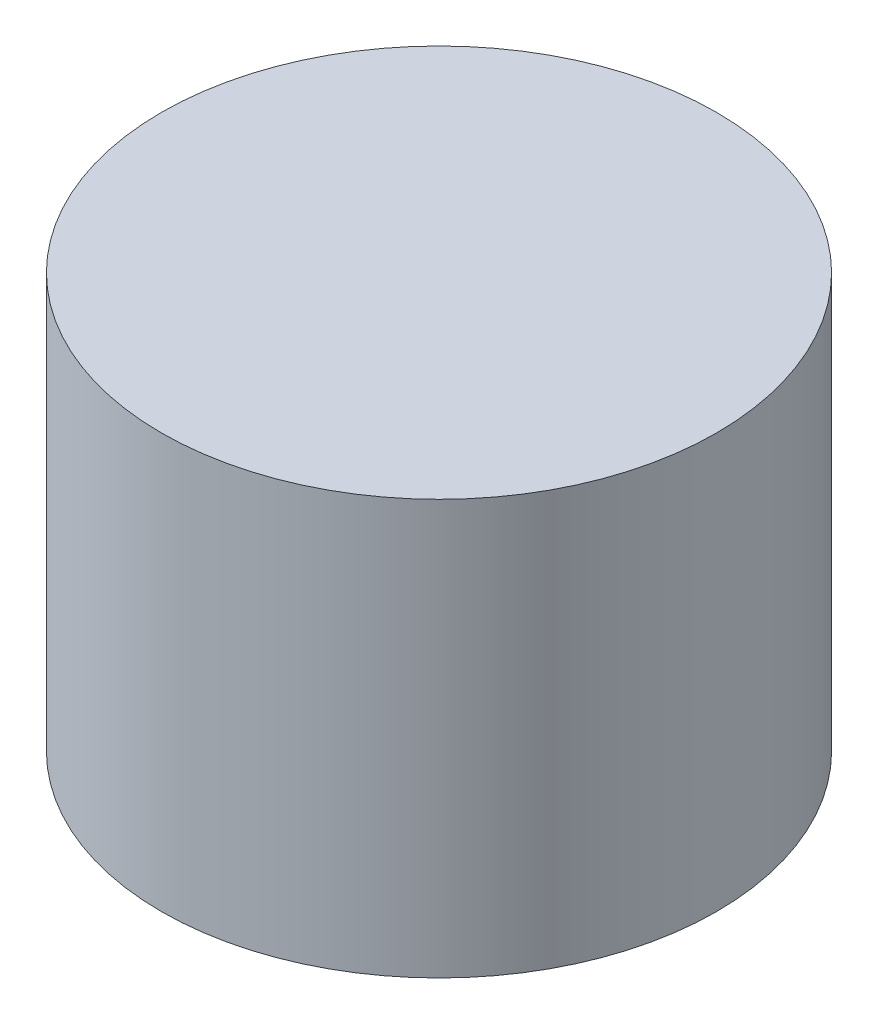
ISO-10303-21;
HEADER;
FILE_DESCRIPTION(('STEP AP214'),'2;1');
FILE_NAME('part.step','',(''),(''),'','','');
FILE_SCHEMA(('AUTOMOTIVE_DESIGN { 1 0 10303 214 1 1 1 1 }'));
ENDSEC;
DATA;
#1=APPLICATION_CONTEXT('core data for automotive mechanical design processes');
#2=APPLICATION_PROTOCOL_DEFINITION('international standard','automotive_design',2000,#1);
#3=PRODUCT_CONTEXT('',#1,'mechanical');
#4=PRODUCT('Part','Part','',(#3));
#5=PRODUCT_RELATED_PRODUCT_CATEGORY('part','',(#4));
#6=PRODUCT_DEFINITION_FORMATION('','',#4);
#7=PRODUCT_DEFINITION_CONTEXT('part definition',#1,'design');
#8=PRODUCT_DEFINITION('design','',#6,#7);
#9=PRODUCT_DEFINITION_SHAPE('','',#8);
#10=(LENGTH_UNIT() NAMED_UNIT(*) SI_UNIT(.MILLI.,.METRE.));
#11=(NAMED_UNIT(*) PLANE_ANGLE_UNIT() SI_UNIT($,.RADIAN.));
#12=(NAMED_UNIT(*) SI_UNIT($,.STERADIAN.) SOLID_ANGLE_UNIT());
#13=UNCERTAINTY_MEASURE_WITH_UNIT(LENGTH_MEASURE(1.E-05),#10,'distance_accuracy_value','');
#14=(GEOMETRIC_REPRESENTATION_CONTEXT(3) GLOBAL_UNCERTAINTY_ASSIGNED_CONTEXT((#13)) GLOBAL_UNIT_ASSIGNED_CONTEXT((#10,
#11,#12)) REPRESENTATION_CONTEXT('',''));
#15=CARTESIAN_POINT('',(0.,0.,0.));
#16=DIRECTION('',(0.,0.,1.));
#17=DIRECTION('',(1.,0.,0.));
#18=AXIS2_PLACEMENT_3D('',#15,#16,#17);
#19=CARTESIAN_POINT('',(0.,11.2,0.));
#20=DIRECTION('',(0.,-1.,0.));
#21=DIRECTION('',(0.,0.,-1.));
#22=AXIS2_PLACEMENT_3D('',#19,#20,#21);
#23=CYLINDRICAL_SURFACE('',#22,7.5);
#24=CARTESIAN_POINT('',(0.,11.2,0.));
#25=DIRECTION('',(0.,1.,0.));
#26=DIRECTION('',(0.,0.,1.));
#27=AXIS2_PLACEMENT_3D('',#24,#25,#26);
#28=CIRCLE('',#27,7.5);
#29=CARTESIAN_POINT('',(0.,11.2,7.5));
#30=VERTEX_POINT('',#29);
#31=EDGE_CURVE('E10',#30,#30,#28,.T.);
#32=ORIENTED_EDGE('',*,*,#31,.F.);
#33=EDGE_LOOP('',(#32));
#34=FACE_BOUND('',#33,.T.);
#35=CARTESIAN_POINT('',(0.,0.,0.));
#36=DIRECTION('',(0.,1.,0.));
#37=DIRECTION('',(0.,0.,1.));
#38=AXIS2_PLACEMENT_3D('',#35,#36,#37);
#39=CIRCLE('',#38,7.5);
#40=CARTESIAN_POINT('',(0.,0.,7.5));
#41=VERTEX_POINT('',#40);
#42=EDGE_CURVE('E34',#41,#41,#39,.T.);
#43=ORIENTED_EDGE('',*,*,#42,.T.);
#44=EDGE_LOOP('',(#43));
#45=FACE_BOUND('',#44,.T.);
#46=ADVANCED_FACE('F31',(#34,#45),#23,.T.);
#47=CARTESIAN_POINT('',(0.,11.2,0.));
#48=DIRECTION('',(0.,1.,0.));
#49=DIRECTION('',(0.,0.,1.));
#50=AXIS2_PLACEMENT_3D('',#47,#48,#49);
#51=PLANE('',#50);
#52=ORIENTED_EDGE('',*,*,#31,.T.);
#53=EDGE_LOOP('',(#52));
#54=FACE_BOUND('',#53,.T.);
#55=ADVANCED_FACE('F46',(#54),#51,.T.);
#56=CARTESIAN_POINT('',(0.,0.,0.));
#57=DIRECTION('',(0.,1.,0.));
#58=DIRECTION('',(0.,0.,1.));
#59=AXIS2_PLACEMENT_3D('',#56,#57,#58);
#60=PLANE('',#59);
#61=ORIENTED_EDGE('',*,*,#42,.F.);
#62=EDGE_LOOP('',(#61));
#63=FACE_BOUND('',#62,.T.);
#64=ADVANCED_FACE('F44',(#63),#60,.F.);
#65=CLOSED_SHELL('',(#46,#55,#64));
#66=MANIFOLD_SOLID_BREP('B2',#65);
#67=ADVANCED_BREP_SHAPE_REPRESENTATION('',(#18,#66),#14);
#68=SHAPE_DEFINITION_REPRESENTATION(#9,#67);
ENDSEC;
END-ISO-10303-21;
